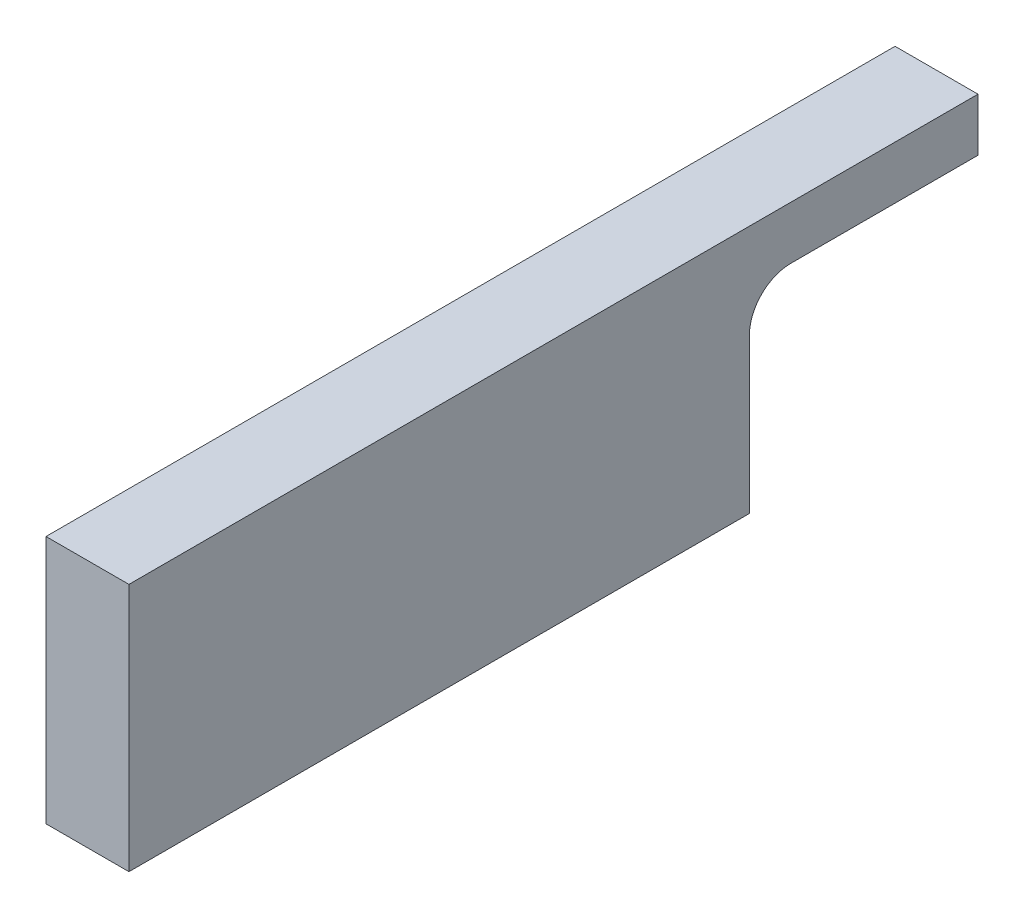
ISO-10303-21;
HEADER;
FILE_DESCRIPTION(('STEP AP214'),'2;1');
FILE_NAME('part.step','',(''),(''),'','','');
FILE_SCHEMA(('AUTOMOTIVE_DESIGN { 1 0 10303 214 1 1 1 1 }'));
ENDSEC;
DATA;
#1=APPLICATION_CONTEXT('core data for automotive mechanical design processes');
#2=APPLICATION_PROTOCOL_DEFINITION('international standard','automotive_design',2000,#1);
#3=PRODUCT_CONTEXT('',#1,'mechanical');
#4=PRODUCT('Part','Part','',(#3));
#5=PRODUCT_RELATED_PRODUCT_CATEGORY('part','',(#4));
#6=PRODUCT_DEFINITION_FORMATION('','',#4);
#7=PRODUCT_DEFINITION_CONTEXT('part definition',#1,'design');
#8=PRODUCT_DEFINITION('design','',#6,#7);
#9=PRODUCT_DEFINITION_SHAPE('','',#8);
#10=(LENGTH_UNIT() NAMED_UNIT(*) SI_UNIT(.MILLI.,.METRE.));
#11=(NAMED_UNIT(*) PLANE_ANGLE_UNIT() SI_UNIT($,.RADIAN.));
#12=(NAMED_UNIT(*) SI_UNIT($,.STERADIAN.) SOLID_ANGLE_UNIT());
#13=UNCERTAINTY_MEASURE_WITH_UNIT(LENGTH_MEASURE(1.E-05),#10,'distance_accuracy_value','');
#14=(GEOMETRIC_REPRESENTATION_CONTEXT(3) GLOBAL_UNCERTAINTY_ASSIGNED_CONTEXT((#13)) GLOBAL_UNIT_ASSIGNED_CONTEXT((#10,
#11,#12)) REPRESENTATION_CONTEXT('',''));
#15=CARTESIAN_POINT('',(0.,0.,0.));
#16=DIRECTION('',(0.,0.,1.));
#17=DIRECTION('',(1.,0.,0.));
#18=AXIS2_PLACEMENT_3D('',#15,#16,#17);
#19=CARTESIAN_POINT('',(12.7,38.1,130.));
#20=DIRECTION('',(0.,0.,-1.));
#21=DIRECTION('',(-1.,0.,0.));
#22=AXIS2_PLACEMENT_3D('',#19,#20,#21);
#23=PLANE('',#22);
#24=DIRECTION('',(0.,-1.,0.));
#25=VECTOR('',#24,1.);
#26=CARTESIAN_POINT('',(-12.7,38.1,130.));
#27=LINE('',#26,#25);
#28=CARTESIAN_POINT('',(-12.7,38.1,130.));
#29=VERTEX_POINT('',#28);
#30=CARTESIAN_POINT('',(-12.7,-38.1,130.));
#31=VERTEX_POINT('',#30);
#32=EDGE_CURVE('E124',#29,#31,#27,.T.);
#33=ORIENTED_EDGE('',*,*,#32,.T.);
#34=DIRECTION('',(-1.,0.,0.));
#35=VECTOR('',#34,1.);
#36=CARTESIAN_POINT('',(12.7,-38.1,130.));
#37=LINE('',#36,#35);
#38=CARTESIAN_POINT('',(12.7,-38.1,130.));
#39=VERTEX_POINT('',#38);
#40=EDGE_CURVE('E11',#39,#31,#37,.T.);
#41=ORIENTED_EDGE('',*,*,#40,.F.);
#42=DIRECTION('',(0.,-1.,0.));
#43=VECTOR('',#42,1.);
#44=CARTESIAN_POINT('',(12.7,38.1,130.));
#45=LINE('',#44,#43);
#46=CARTESIAN_POINT('',(12.7,38.1,130.));
#47=VERTEX_POINT('',#46);
#48=EDGE_CURVE('E136',#47,#39,#45,.T.);
#49=ORIENTED_EDGE('',*,*,#48,.F.);
#50=DIRECTION('',(-1.,0.,0.));
#51=VECTOR('',#50,1.);
#52=CARTESIAN_POINT('',(12.7,38.1,130.));
#53=LINE('',#52,#51);
#54=EDGE_CURVE('E120',#47,#29,#53,.T.);
#55=ORIENTED_EDGE('',*,*,#54,.T.);
#56=EDGE_LOOP('',(#33,#41,#49,#55));
#57=FACE_BOUND('',#56,.T.);
#58=ADVANCED_FACE('F34',(#57),#23,.F.);
#59=CARTESIAN_POINT('',(12.7,-38.1,130.));
#60=DIRECTION('',(0.,1.,0.));
#61=DIRECTION('',(0.,0.,1.));
#62=AXIS2_PLACEMENT_3D('',#59,#60,#61);
#63=PLANE('',#62);
#64=DIRECTION('',(0.,0.,-1.));
#65=VECTOR('',#64,1.);
#66=CARTESIAN_POINT('',(-12.7,-38.1,130.));
#67=LINE('',#66,#65);
#68=CARTESIAN_POINT('',(-12.7,-38.1,-60.));
#69=VERTEX_POINT('',#68);
#70=EDGE_CURVE('E127',#31,#69,#67,.T.);
#71=ORIENTED_EDGE('',*,*,#70,.T.);
#72=DIRECTION('',(-1.,0.,0.));
#73=VECTOR('',#72,1.);
#74=CARTESIAN_POINT('',(12.7,-38.1,-60.));
#75=LINE('',#74,#73);
#76=CARTESIAN_POINT('',(12.7,-38.1,-60.));
#77=VERTEX_POINT('',#76);
#78=EDGE_CURVE('E42',#77,#69,#75,.T.);
#79=ORIENTED_EDGE('',*,*,#78,.F.);
#80=DIRECTION('',(0.,0.,-1.));
#81=VECTOR('',#80,1.);
#82=CARTESIAN_POINT('',(12.7,-38.1,130.));
#83=LINE('',#82,#81);
#84=EDGE_CURVE('E90',#39,#77,#83,.T.);
#85=ORIENTED_EDGE('',*,*,#84,.F.);
#86=ORIENTED_EDGE('',*,*,#40,.T.);
#87=EDGE_LOOP('',(#71,#79,#85,#86));
#88=FACE_BOUND('',#87,.T.);
#89=ADVANCED_FACE('F161',(#88),#63,.F.);
#90=CARTESIAN_POINT('',(12.7,9.19999999999999,-60.));
#91=DIRECTION('',(0.,0.,1.));
#92=DIRECTION('',(0.,-1.,0.));
#93=AXIS2_PLACEMENT_3D('',#90,#91,#92);
#94=PLANE('',#93);
#95=DIRECTION('',(0.,1.,0.));
#96=VECTOR('',#95,1.);
#97=CARTESIAN_POINT('',(-12.7,9.19999999999999,-60.));
#98=LINE('',#97,#96);
#99=CARTESIAN_POINT('',(-12.7,9.2,-60.));
#100=VERTEX_POINT('',#99);
#101=EDGE_CURVE('E129',#69,#100,#98,.T.);
#102=ORIENTED_EDGE('',*,*,#101,.T.);
#103=DIRECTION('',(-1.,0.,0.));
#104=VECTOR('',#103,1.);
#105=CARTESIAN_POINT('',(12.7,9.2,-60.));
#106=LINE('',#105,#104);
#107=CARTESIAN_POINT('',(12.7,9.2,-60.));
#108=VERTEX_POINT('',#107);
#109=EDGE_CURVE('E140',#108,#100,#106,.T.);
#110=ORIENTED_EDGE('',*,*,#109,.F.);
#111=DIRECTION('',(0.,1.,0.));
#112=VECTOR('',#111,1.);
#113=CARTESIAN_POINT('',(12.7,9.19999999999999,-60.));
#114=LINE('',#113,#112);
#115=EDGE_CURVE('E148',#77,#108,#114,.T.);
#116=ORIENTED_EDGE('',*,*,#115,.F.);
#117=ORIENTED_EDGE('',*,*,#78,.T.);
#118=EDGE_LOOP('',(#102,#110,#116,#117));
#119=FACE_BOUND('',#118,.T.);
#120=ADVANCED_FACE('F146',(#119),#94,.F.);
#121=CARTESIAN_POINT('',(12.7,9.2,-72.7));
#122=DIRECTION('',(-1.,0.,0.));
#123=DIRECTION('',(0.,0.,1.));
#124=AXIS2_PLACEMENT_3D('',#121,#122,#123);
#125=CYLINDRICAL_SURFACE('',#124,12.7);
#126=CARTESIAN_POINT('',(-12.7,9.2,-72.7));
#127=DIRECTION('',(-1.,0.,0.));
#128=DIRECTION('',(0.,0.,-1.));
#129=AXIS2_PLACEMENT_3D('',#126,#127,#128);
#130=CIRCLE('',#129,12.7);
#131=CARTESIAN_POINT('',(-12.7,21.9,-72.7));
#132=VERTEX_POINT('',#131);
#133=EDGE_CURVE('E131',#100,#132,#130,.T.);
#134=ORIENTED_EDGE('',*,*,#133,.T.);
#135=DIRECTION('',(-1.,0.,0.));
#136=VECTOR('',#135,1.);
#137=CARTESIAN_POINT('',(12.7,21.9,-72.7));
#138=LINE('',#137,#136);
#139=CARTESIAN_POINT('',(12.7,21.9,-72.7));
#140=VERTEX_POINT('',#139);
#141=EDGE_CURVE('E115',#140,#132,#138,.T.);
#142=ORIENTED_EDGE('',*,*,#141,.F.);
#143=CARTESIAN_POINT('',(12.7,9.2,-72.7));
#144=DIRECTION('',(-1.,0.,0.));
#145=DIRECTION('',(0.,0.,-1.));
#146=AXIS2_PLACEMENT_3D('',#143,#144,#145);
#147=CIRCLE('',#146,12.7);
#148=EDGE_CURVE('E106',#108,#140,#147,.T.);
#149=ORIENTED_EDGE('',*,*,#148,.F.);
#150=ORIENTED_EDGE('',*,*,#109,.T.);
#151=EDGE_LOOP('',(#134,#142,#149,#150));
#152=FACE_BOUND('',#151,.T.);
#153=ADVANCED_FACE('F154',(#152),#125,.F.);
#154=CARTESIAN_POINT('',(12.7,21.9,-130.));
#155=DIRECTION('',(0.,1.,0.));
#156=DIRECTION('',(0.,0.,1.));
#157=AXIS2_PLACEMENT_3D('',#154,#155,#156);
#158=PLANE('',#157);
#159=DIRECTION('',(0.,0.,-1.));
#160=VECTOR('',#159,1.);
#161=CARTESIAN_POINT('',(-12.7,21.9,-130.));
#162=LINE('',#161,#160);
#163=CARTESIAN_POINT('',(-12.7,21.9,-130.));
#164=VERTEX_POINT('',#163);
#165=EDGE_CURVE('E114',#132,#164,#162,.T.);
#166=ORIENTED_EDGE('',*,*,#165,.T.);
#167=DIRECTION('',(-1.,0.,0.));
#168=VECTOR('',#167,1.);
#169=CARTESIAN_POINT('',(12.7,21.9,-130.));
#170=LINE('',#169,#168);
#171=CARTESIAN_POINT('',(12.7,21.9,-130.));
#172=VERTEX_POINT('',#171);
#173=EDGE_CURVE('E111',#172,#164,#170,.T.);
#174=ORIENTED_EDGE('',*,*,#173,.F.);
#175=DIRECTION('',(0.,0.,-1.));
#176=VECTOR('',#175,1.);
#177=CARTESIAN_POINT('',(12.7,21.9,-130.));
#178=LINE('',#177,#176);
#179=EDGE_CURVE('E100',#140,#172,#178,.T.);
#180=ORIENTED_EDGE('',*,*,#179,.F.);
#181=ORIENTED_EDGE('',*,*,#141,.T.);
#182=EDGE_LOOP('',(#166,#174,#180,#181));
#183=FACE_BOUND('',#182,.T.);
#184=ADVANCED_FACE('F112',(#183),#158,.F.);
#185=CARTESIAN_POINT('',(12.7,38.1,-130.));
#186=DIRECTION('',(0.,0.,1.));
#187=DIRECTION('',(1.,0.,0.));
#188=AXIS2_PLACEMENT_3D('',#185,#186,#187);
#189=PLANE('',#188);
#190=DIRECTION('',(0.,1.,0.));
#191=VECTOR('',#190,1.);
#192=CARTESIAN_POINT('',(-12.7,38.1,-130.));
#193=LINE('',#192,#191);
#194=CARTESIAN_POINT('',(-12.7,38.1,-130.));
#195=VERTEX_POINT('',#194);
#196=EDGE_CURVE('E76',#164,#195,#193,.T.);
#197=ORIENTED_EDGE('',*,*,#196,.T.);
#198=DIRECTION('',(-1.,0.,0.));
#199=VECTOR('',#198,1.);
#200=CARTESIAN_POINT('',(12.7,38.1,-130.));
#201=LINE('',#200,#199);
#202=CARTESIAN_POINT('',(12.7,38.1,-130.));
#203=VERTEX_POINT('',#202);
#204=EDGE_CURVE('E116',#203,#195,#201,.T.);
#205=ORIENTED_EDGE('',*,*,#204,.F.);
#206=DIRECTION('',(0.,1.,0.));
#207=VECTOR('',#206,1.);
#208=CARTESIAN_POINT('',(12.7,38.1,-130.));
#209=LINE('',#208,#207);
#210=EDGE_CURVE('E104',#172,#203,#209,.T.);
#211=ORIENTED_EDGE('',*,*,#210,.F.);
#212=ORIENTED_EDGE('',*,*,#173,.T.);
#213=EDGE_LOOP('',(#197,#205,#211,#212));
#214=FACE_BOUND('',#213,.T.);
#215=ADVANCED_FACE('F118',(#214),#189,.F.);
#216=CARTESIAN_POINT('',(12.7,38.1,130.));
#217=DIRECTION('',(0.,-1.,0.));
#218=DIRECTION('',(0.,0.,-1.));
#219=AXIS2_PLACEMENT_3D('',#216,#217,#218);
#220=PLANE('',#219);
#221=DIRECTION('',(0.,0.,1.));
#222=VECTOR('',#221,1.);
#223=CARTESIAN_POINT('',(-12.7,38.1,130.));
#224=LINE('',#223,#222);
#225=EDGE_CURVE('E82',#195,#29,#224,.T.);
#226=ORIENTED_EDGE('',*,*,#225,.T.);
#227=ORIENTED_EDGE('',*,*,#54,.F.);
#228=DIRECTION('',(0.,0.,1.));
#229=VECTOR('',#228,1.);
#230=CARTESIAN_POINT('',(12.7,38.1,130.));
#231=LINE('',#230,#229);
#232=EDGE_CURVE('E50',#203,#47,#231,.T.);
#233=ORIENTED_EDGE('',*,*,#232,.F.);
#234=ORIENTED_EDGE('',*,*,#204,.T.);
#235=EDGE_LOOP('',(#226,#227,#233,#234));
#236=FACE_BOUND('',#235,.T.);
#237=ADVANCED_FACE('F175',(#236),#220,.F.);
#238=CARTESIAN_POINT('',(12.7,9.2,-72.7));
#239=DIRECTION('',(1.,0.,0.));
#240=DIRECTION('',(0.,0.,-1.));
#241=AXIS2_PLACEMENT_3D('',#238,#239,#240);
#242=PLANE('',#241);
#243=ORIENTED_EDGE('',*,*,#48,.T.);
#244=ORIENTED_EDGE('',*,*,#84,.T.);
#245=ORIENTED_EDGE('',*,*,#115,.T.);
#246=ORIENTED_EDGE('',*,*,#148,.T.);
#247=ORIENTED_EDGE('',*,*,#179,.T.);
#248=ORIENTED_EDGE('',*,*,#210,.T.);
#249=ORIENTED_EDGE('',*,*,#232,.T.);
#250=EDGE_LOOP('',(#243,#244,#245,#246,#247,#248,#249));
#251=FACE_BOUND('',#250,.T.);
#252=ADVANCED_FACE('F102',(#251),#242,.T.);
#253=CARTESIAN_POINT('',(-12.7,9.2,-72.7));
#254=DIRECTION('',(1.,0.,0.));
#255=DIRECTION('',(0.,0.,-1.));
#256=AXIS2_PLACEMENT_3D('',#253,#254,#255);
#257=PLANE('',#256);
#258=ORIENTED_EDGE('',*,*,#32,.F.);
#259=ORIENTED_EDGE('',*,*,#225,.F.);
#260=ORIENTED_EDGE('',*,*,#196,.F.);
#261=ORIENTED_EDGE('',*,*,#165,.F.);
#262=ORIENTED_EDGE('',*,*,#133,.F.);
#263=ORIENTED_EDGE('',*,*,#101,.F.);
#264=ORIENTED_EDGE('',*,*,#70,.F.);
#265=EDGE_LOOP('',(#258,#259,#260,#261,#262,#263,#264));
#266=FACE_BOUND('',#265,.T.);
#267=ADVANCED_FACE('F152',(#266),#257,.F.);
#268=CLOSED_SHELL('',(#58,#89,#120,#153,#184,#215,#237,#252,#267));
#269=MANIFOLD_SOLID_BREP('B2',#268);
#270=ADVANCED_BREP_SHAPE_REPRESENTATION('',(#18,#269),#14);
#271=SHAPE_DEFINITION_REPRESENTATION(#9,#270);
ENDSEC;
END-ISO-10303-21;
